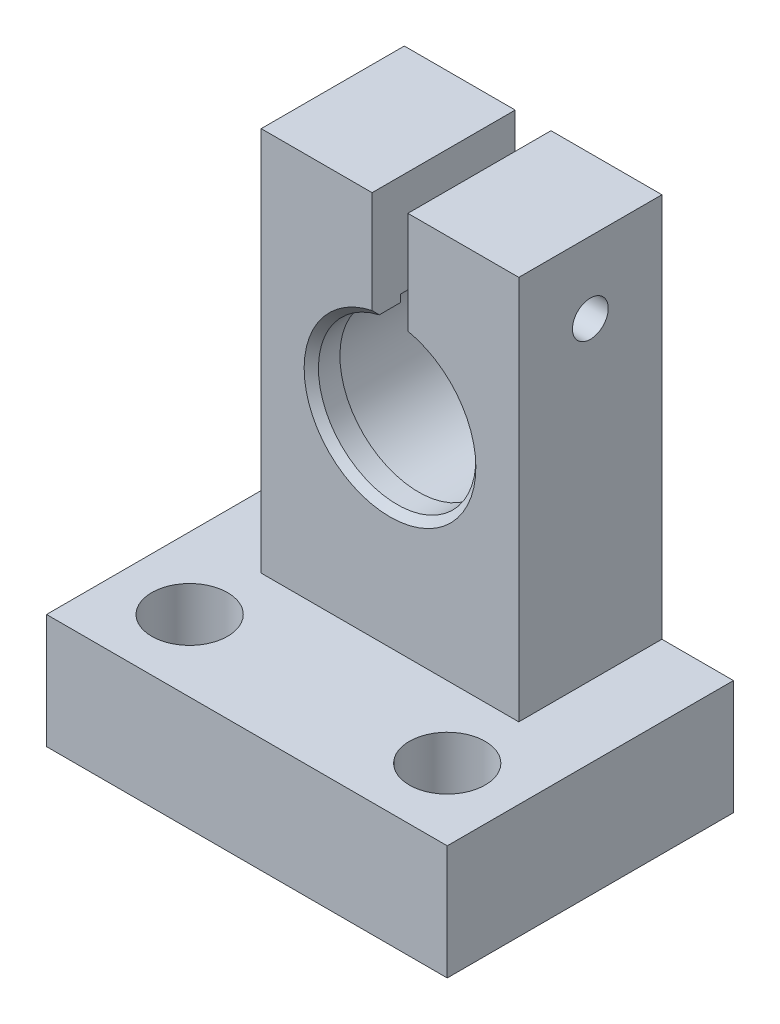
ISO-10303-21;
HEADER;
FILE_DESCRIPTION(('STEP AP214'),'2;1');
FILE_NAME('part.step','',(''),(''),'','','');
FILE_SCHEMA(('AUTOMOTIVE_DESIGN { 1 0 10303 214 1 1 1 1 }'));
ENDSEC;
DATA;
#1=APPLICATION_CONTEXT('core data for automotive mechanical design processes');
#2=APPLICATION_PROTOCOL_DEFINITION('international standard','automotive_design',2000,#1);
#3=PRODUCT_CONTEXT('',#1,'mechanical');
#4=PRODUCT('Part','Part','',(#3));
#5=PRODUCT_RELATED_PRODUCT_CATEGORY('part','',(#4));
#6=PRODUCT_DEFINITION_FORMATION('','',#4);
#7=PRODUCT_DEFINITION_CONTEXT('part definition',#1,'design');
#8=PRODUCT_DEFINITION('design','',#6,#7);
#9=PRODUCT_DEFINITION_SHAPE('','',#8);
#10=(LENGTH_UNIT() NAMED_UNIT(*) SI_UNIT(.MILLI.,.METRE.));
#11=(NAMED_UNIT(*) PLANE_ANGLE_UNIT() SI_UNIT($,.RADIAN.));
#12=(NAMED_UNIT(*) SI_UNIT($,.STERADIAN.) SOLID_ANGLE_UNIT());
#13=UNCERTAINTY_MEASURE_WITH_UNIT(LENGTH_MEASURE(1.E-05),#10,'distance_accuracy_value','');
#14=(GEOMETRIC_REPRESENTATION_CONTEXT(3) GLOBAL_UNCERTAINTY_ASSIGNED_CONTEXT((#13)) GLOBAL_UNIT_ASSIGNED_CONTEXT((#10,
#11,#12)) REPRESENTATION_CONTEXT('',''));
#15=CARTESIAN_POINT('',(0.,0.,0.));
#16=DIRECTION('',(0.,0.,1.));
#17=DIRECTION('',(1.,0.,0.));
#18=AXIS2_PLACEMENT_3D('',#15,#16,#17);
#19=CARTESIAN_POINT('',(42.,-13.9,0.));
#20=DIRECTION('',(0.,-1.,0.));
#21=DIRECTION('',(0.,0.,-1.));
#22=AXIS2_PLACEMENT_3D('',#19,#20,#21);
#23=PLANE('',#22);
#24=DIRECTION('',(0.,0.,-1.));
#25=VECTOR('',#24,1.);
#26=CARTESIAN_POINT('',(37.,-13.9,0.));
#27=LINE('',#26,#25);
#28=CARTESIAN_POINT('',(37.,-13.9,10.));
#29=VERTEX_POINT('',#28);
#30=CARTESIAN_POINT('',(37.,-13.9,0.));
#31=VERTEX_POINT('',#30);
#32=EDGE_CURVE('E193',#29,#31,#27,.T.);
#33=ORIENTED_EDGE('',*,*,#32,.F.);
#34=DIRECTION('',(1.,0.,0.));
#35=VECTOR('',#34,1.);
#36=CARTESIAN_POINT('',(42.,-13.9,10.));
#37=LINE('',#36,#35);
#38=CARTESIAN_POINT('',(19.,-13.9,10.));
#39=VERTEX_POINT('',#38);
#40=EDGE_CURVE('E11',#39,#29,#37,.T.);
#41=ORIENTED_EDGE('',*,*,#40,.F.);
#42=DIRECTION('',(0.,0.,-1.));
#43=VECTOR('',#42,1.);
#44=CARTESIAN_POINT('',(19.,-13.9,0.));
#45=LINE('',#44,#43);
#46=CARTESIAN_POINT('',(19.,-13.9,0.));
#47=VERTEX_POINT('',#46);
#48=EDGE_CURVE('E188',#39,#47,#45,.T.);
#49=ORIENTED_EDGE('',*,*,#48,.T.);
#50=DIRECTION('',(1.,0.,0.));
#51=VECTOR('',#50,1.);
#52=CARTESIAN_POINT('',(14.,-13.9,0.));
#53=LINE('',#52,#51);
#54=CARTESIAN_POINT('',(14.,-13.9,0.));
#55=VERTEX_POINT('',#54);
#56=EDGE_CURVE('E174',#55,#47,#53,.T.);
#57=ORIENTED_EDGE('',*,*,#56,.F.);
#58=DIRECTION('',(0.,0.,-1.));
#59=VECTOR('',#58,1.);
#60=CARTESIAN_POINT('',(14.,-13.9,0.));
#61=LINE('',#60,#59);
#62=CARTESIAN_POINT('',(14.,-13.9,20.));
#63=VERTEX_POINT('',#62);
#64=EDGE_CURVE('E175',#63,#55,#61,.T.);
#65=ORIENTED_EDGE('',*,*,#64,.F.);
#66=DIRECTION('',(-1.,0.,0.));
#67=VECTOR('',#66,1.);
#68=CARTESIAN_POINT('',(42.,-13.9,20.));
#69=LINE('',#68,#67);
#70=CARTESIAN_POINT('',(42.,-13.9,20.));
#71=VERTEX_POINT('',#70);
#72=EDGE_CURVE('E161',#71,#63,#69,.T.);
#73=ORIENTED_EDGE('',*,*,#72,.F.);
#74=DIRECTION('',(0.,0.,-1.));
#75=VECTOR('',#74,1.);
#76=CARTESIAN_POINT('',(42.,-13.9,0.));
#77=LINE('',#76,#75);
#78=CARTESIAN_POINT('',(42.,-13.9,0.));
#79=VERTEX_POINT('',#78);
#80=EDGE_CURVE('E198',#71,#79,#77,.T.);
#81=ORIENTED_EDGE('',*,*,#80,.T.);
#82=DIRECTION('',(-1.,0.,0.));
#83=VECTOR('',#82,1.);
#84=CARTESIAN_POINT('',(42.,-13.9,0.));
#85=LINE('',#84,#83);
#86=EDGE_CURVE('E201',#79,#31,#85,.T.);
#87=ORIENTED_EDGE('',*,*,#86,.T.);
#88=EDGE_LOOP('',(#33,#41,#49,#57,#65,#73,#81,#87));
#89=FACE_BOUND('',#88,.T.);
#90=CARTESIAN_POINT('',(19.,-13.9,15.));
#91=DIRECTION('',(0.,-1.,0.));
#92=DIRECTION('',(0.,0.,1.));
#93=AXIS2_PLACEMENT_3D('',#90,#91,#92);
#94=CIRCLE('',#93,2.65);
#95=CARTESIAN_POINT('',(19.,-13.9,17.65));
#96=VERTEX_POINT('',#95);
#97=EDGE_CURVE('E182',#96,#96,#94,.T.);
#98=ORIENTED_EDGE('',*,*,#97,.T.);
#99=EDGE_LOOP('',(#98));
#100=FACE_BOUND('',#99,.T.);
#101=CARTESIAN_POINT('',(37.,-13.9,15.));
#102=DIRECTION('',(0.,-1.,0.));
#103=DIRECTION('',(0.,0.,1.));
#104=AXIS2_PLACEMENT_3D('',#101,#102,#103);
#105=CIRCLE('',#104,2.65);
#106=CARTESIAN_POINT('',(37.,-13.9,17.65));
#107=VERTEX_POINT('',#106);
#108=EDGE_CURVE('E626',#107,#107,#105,.T.);
#109=ORIENTED_EDGE('',*,*,#108,.T.);
#110=EDGE_LOOP('',(#109));
#111=FACE_BOUND('',#110,.T.);
#112=ADVANCED_FACE('F36',(#89,#100,#111),#23,.F.);
#113=CARTESIAN_POINT('',(37.,-21.9,10.));
#114=DIRECTION('',(-1.,0.,0.));
#115=DIRECTION('',(0.,0.,-1.));
#116=AXIS2_PLACEMENT_3D('',#113,#114,#115);
#117=PLANE('',#116);
#118=CARTESIAN_POINT('',(37.,7.99999999999999,5.));
#119=DIRECTION('',(-1.,0.,0.));
#120=DIRECTION('',(0.,0.,1.));
#121=AXIS2_PLACEMENT_3D('',#118,#119,#120);
#122=CIRCLE('',#121,1.25);
#123=CARTESIAN_POINT('',(37.,7.99999999999999,6.25));
#124=VERTEX_POINT('',#123);
#125=EDGE_CURVE('E205',#124,#124,#122,.T.);
#126=ORIENTED_EDGE('',*,*,#125,.T.);
#127=EDGE_LOOP('',(#126));
#128=FACE_BOUND('',#127,.T.);
#129=ORIENTED_EDGE('',*,*,#32,.T.);
#130=DIRECTION('',(0.,-1.,0.));
#131=VECTOR('',#130,1.);
#132=CARTESIAN_POINT('',(37.,-21.9,0.));
#133=LINE('',#132,#131);
#134=CARTESIAN_POINT('',(37.,13.,0.));
#135=VERTEX_POINT('',#134);
#136=EDGE_CURVE('E254',#135,#31,#133,.T.);
#137=ORIENTED_EDGE('',*,*,#136,.F.);
#138=DIRECTION('',(0.,0.,-1.));
#139=VECTOR('',#138,1.);
#140=CARTESIAN_POINT('',(37.,13.,10.));
#141=LINE('',#140,#139);
#142=CARTESIAN_POINT('',(37.,13.,10.));
#143=VERTEX_POINT('',#142);
#144=EDGE_CURVE('E264',#143,#135,#141,.T.);
#145=ORIENTED_EDGE('',*,*,#144,.F.);
#146=DIRECTION('',(0.,-1.,0.));
#147=VECTOR('',#146,1.);
#148=CARTESIAN_POINT('',(37.,-21.9,10.));
#149=LINE('',#148,#147);
#150=EDGE_CURVE('E61',#143,#29,#149,.T.);
#151=ORIENTED_EDGE('',*,*,#150,.T.);
#152=EDGE_LOOP('',(#129,#137,#145,#151));
#153=FACE_BOUND('',#152,.T.);
#154=ADVANCED_FACE('F336',(#128,#153),#117,.F.);
#155=CARTESIAN_POINT('',(19.,-21.9,10.));
#156=DIRECTION('',(1.,0.,0.));
#157=DIRECTION('',(0.,0.,1.));
#158=AXIS2_PLACEMENT_3D('',#155,#156,#157);
#159=PLANE('',#158);
#160=DIRECTION('',(0.,1.,0.));
#161=VECTOR('',#160,1.);
#162=CARTESIAN_POINT('',(19.,-21.9,10.));
#163=LINE('',#162,#161);
#164=CARTESIAN_POINT('',(19.,13.,10.));
#165=VERTEX_POINT('',#164);
#166=EDGE_CURVE('E256',#39,#165,#163,.T.);
#167=ORIENTED_EDGE('',*,*,#166,.T.);
#168=DIRECTION('',(0.,0.,-1.));
#169=VECTOR('',#168,1.);
#170=CARTESIAN_POINT('',(19.,13.,10.));
#171=LINE('',#170,#169);
#172=CARTESIAN_POINT('',(19.,13.,0.));
#173=VERTEX_POINT('',#172);
#174=EDGE_CURVE('E274',#165,#173,#171,.T.);
#175=ORIENTED_EDGE('',*,*,#174,.T.);
#176=DIRECTION('',(0.,1.,0.));
#177=VECTOR('',#176,1.);
#178=CARTESIAN_POINT('',(19.,-21.9,0.));
#179=LINE('',#178,#177);
#180=EDGE_CURVE('E53',#47,#173,#179,.T.);
#181=ORIENTED_EDGE('',*,*,#180,.F.);
#182=ORIENTED_EDGE('',*,*,#48,.F.);
#183=EDGE_LOOP('',(#167,#175,#181,#182));
#184=FACE_BOUND('',#183,.T.);
#185=CARTESIAN_POINT('',(19.,8.,5.));
#186=DIRECTION('',(1.,0.,0.));
#187=DIRECTION('',(0.,0.,-1.));
#188=AXIS2_PLACEMENT_3D('',#185,#186,#187);
#189=CIRCLE('',#188,3.25);
#190=CARTESIAN_POINT('',(19.,8.,1.75));
#191=VERTEX_POINT('',#190);
#192=EDGE_CURVE('E211',#191,#191,#189,.T.);
#193=ORIENTED_EDGE('',*,*,#192,.T.);
#194=EDGE_LOOP('',(#193));
#195=FACE_BOUND('',#194,.T.);
#196=ADVANCED_FACE('F340',(#184,#195),#159,.F.);
#197=CARTESIAN_POINT('',(19.,13.,10.));
#198=DIRECTION('',(0.,-1.,0.));
#199=DIRECTION('',(-1.,0.,0.));
#200=AXIS2_PLACEMENT_3D('',#197,#198,#199);
#201=PLANE('',#200);
#202=DIRECTION('',(1.,0.,0.));
#203=VECTOR('',#202,1.);
#204=CARTESIAN_POINT('',(19.,13.,10.));
#205=LINE('',#204,#203);
#206=CARTESIAN_POINT('',(29.25,13.,10.));
#207=VERTEX_POINT('',#206);
#208=EDGE_CURVE('E260',#207,#143,#205,.T.);
#209=ORIENTED_EDGE('',*,*,#208,.T.);
#210=ORIENTED_EDGE('',*,*,#144,.T.);
#211=DIRECTION('',(1.,0.,0.));
#212=VECTOR('',#211,1.);
#213=CARTESIAN_POINT('',(19.,13.,0.));
#214=LINE('',#213,#212);
#215=CARTESIAN_POINT('',(29.25,13.,0.));
#216=VERTEX_POINT('',#215);
#217=EDGE_CURVE('E269',#216,#135,#214,.T.);
#218=ORIENTED_EDGE('',*,*,#217,.F.);
#219=DIRECTION('',(0.,0.,1.));
#220=VECTOR('',#219,1.);
#221=CARTESIAN_POINT('',(29.25,13.,0.));
#222=LINE('',#221,#220);
#223=EDGE_CURVE('E236',#216,#207,#222,.T.);
#224=ORIENTED_EDGE('',*,*,#223,.T.);
#225=EDGE_LOOP('',(#209,#210,#218,#224));
#226=FACE_BOUND('',#225,.T.);
#227=ADVANCED_FACE('F349',(#226),#201,.F.);
#228=CARTESIAN_POINT('',(28.,0.,10.));
#229=DIRECTION('',(0.,0.,1.));
#230=DIRECTION('',(-1.,0.,0.));
#231=AXIS2_PLACEMENT_3D('',#228,#229,#230);
#232=PLANE('',#231);
#233=ORIENTED_EDGE('',*,*,#40,.T.);
#234=ORIENTED_EDGE('',*,*,#150,.F.);
#235=ORIENTED_EDGE('',*,*,#208,.F.);
#236=DIRECTION('',(0.,-1.,0.));
#237=VECTOR('',#236,1.);
#238=CARTESIAN_POINT('',(29.25,5.35607132140714,10.));
#239=LINE('',#238,#237);
#240=CARTESIAN_POINT('',(29.25,5.86834729715275,10.));
#241=VERTEX_POINT('',#240);
#242=EDGE_CURVE('E223',#207,#241,#239,.T.);
#243=ORIENTED_EDGE('',*,*,#242,.T.);
#244=CARTESIAN_POINT('',(28.,0.,10.));
#245=DIRECTION('',(0.,0.,-1.));
#246=DIRECTION('',(-1.,0.,0.));
#247=AXIS2_PLACEMENT_3D('',#244,#245,#246);
#248=CIRCLE('',#247,6.);
#249=CARTESIAN_POINT('',(26.75,5.86834729715275,10.));
#250=VERTEX_POINT('',#249);
#251=EDGE_CURVE('E329',#250,#241,#248,.F.);
#252=ORIENTED_EDGE('',*,*,#251,.F.);
#253=DIRECTION('',(0.,1.,0.));
#254=VECTOR('',#253,1.);
#255=CARTESIAN_POINT('',(26.75,5.35607132140714,10.));
#256=LINE('',#255,#254);
#257=CARTESIAN_POINT('',(26.75,13.,10.));
#258=VERTEX_POINT('',#257);
#259=EDGE_CURVE('E228',#250,#258,#256,.T.);
#260=ORIENTED_EDGE('',*,*,#259,.T.);
#261=EDGE_CURVE('E261',#165,#258,#205,.T.);
#262=ORIENTED_EDGE('',*,*,#261,.F.);
#263=ORIENTED_EDGE('',*,*,#166,.F.);
#264=EDGE_LOOP('',(#233,#234,#235,#243,#252,#260,#262,#263));
#265=FACE_BOUND('',#264,.T.);
#266=ADVANCED_FACE('F356',(#265),#232,.T.);
#267=CARTESIAN_POINT('',(28.,0.,0.));
#268=DIRECTION('',(0.,0.,1.));
#269=DIRECTION('',(-1.,0.,0.));
#270=AXIS2_PLACEMENT_3D('',#267,#268,#269);
#271=PLANE('',#270);
#272=DIRECTION('',(0.,-1.,0.));
#273=VECTOR('',#272,1.);
#274=CARTESIAN_POINT('',(29.25,5.35607132140714,0.));
#275=LINE('',#274,#273);
#276=CARTESIAN_POINT('',(29.25,6.37867541108654,0.));
#277=VERTEX_POINT('',#276);
#278=EDGE_CURVE('E224',#216,#277,#275,.T.);
#279=ORIENTED_EDGE('',*,*,#278,.F.);
#280=ORIENTED_EDGE('',*,*,#217,.T.);
#281=ORIENTED_EDGE('',*,*,#136,.T.);
#282=ORIENTED_EDGE('',*,*,#86,.F.);
#283=DIRECTION('',(0.,-1.,0.));
#284=VECTOR('',#283,1.);
#285=CARTESIAN_POINT('',(42.,-21.9,0.));
#286=LINE('',#285,#284);
#287=CARTESIAN_POINT('',(42.,-21.9,0.));
#288=VERTEX_POINT('',#287);
#289=EDGE_CURVE('E194',#79,#288,#286,.T.);
#290=ORIENTED_EDGE('',*,*,#289,.T.);
#291=DIRECTION('',(-1.,0.,0.));
#292=VECTOR('',#291,1.);
#293=CARTESIAN_POINT('',(19.,-21.9,0.));
#294=LINE('',#293,#292);
#295=CARTESIAN_POINT('',(14.,-21.9,0.));
#296=VERTEX_POINT('',#295);
#297=EDGE_CURVE('E266',#288,#296,#294,.T.);
#298=ORIENTED_EDGE('',*,*,#297,.T.);
#299=DIRECTION('',(0.,-1.,0.));
#300=VECTOR('',#299,1.);
#301=CARTESIAN_POINT('',(14.,-21.9,0.));
#302=LINE('',#301,#300);
#303=EDGE_CURVE('E170',#55,#296,#302,.T.);
#304=ORIENTED_EDGE('',*,*,#303,.F.);
#305=ORIENTED_EDGE('',*,*,#56,.T.);
#306=ORIENTED_EDGE('',*,*,#180,.T.);
#307=CARTESIAN_POINT('',(26.75,13.,0.));
#308=VERTEX_POINT('',#307);
#309=EDGE_CURVE('E257',#173,#308,#214,.T.);
#310=ORIENTED_EDGE('',*,*,#309,.T.);
#311=DIRECTION('',(0.,1.,0.));
#312=VECTOR('',#311,1.);
#313=CARTESIAN_POINT('',(26.75,5.35607132140714,0.));
#314=LINE('',#313,#312);
#315=CARTESIAN_POINT('',(26.75,6.37867541108654,0.));
#316=VERTEX_POINT('',#315);
#317=EDGE_CURVE('E227',#316,#308,#314,.T.);
#318=ORIENTED_EDGE('',*,*,#317,.F.);
#319=CARTESIAN_POINT('',(28.,0.,0.));
#320=DIRECTION('',(0.,0.,-1.));
#321=DIRECTION('',(-1.,0.,0.));
#322=AXIS2_PLACEMENT_3D('',#319,#320,#321);
#323=CIRCLE('',#322,6.5);
#324=EDGE_CURVE('E284',#277,#316,#323,.T.);
#325=ORIENTED_EDGE('',*,*,#324,.F.);
#326=EDGE_LOOP('',(#279,#280,#281,#282,#290,#298,#304,#305,#306,#310,#318,#325));
#327=FACE_BOUND('',#326,.T.);
#328=ADVANCED_FACE('F345',(#327),#271,.F.);
#329=CARTESIAN_POINT('',(19.,-21.9,10.));
#330=DIRECTION('',(0.,1.,0.));
#331=DIRECTION('',(1.,0.,0.));
#332=AXIS2_PLACEMENT_3D('',#329,#330,#331);
#333=PLANE('',#332);
#334=CARTESIAN_POINT('',(37.,-21.9,15.));
#335=DIRECTION('',(0.,-1.,0.));
#336=DIRECTION('',(1.,0.,0.));
#337=AXIS2_PLACEMENT_3D('',#334,#335,#336);
#338=CIRCLE('',#337,2.65);
#339=CARTESIAN_POINT('',(39.65,-21.9,15.));
#340=VERTEX_POINT('',#339);
#341=EDGE_CURVE('E623',#340,#340,#338,.T.);
#342=ORIENTED_EDGE('',*,*,#341,.F.);
#343=EDGE_LOOP('',(#342));
#344=FACE_BOUND('',#343,.T.);
#345=CARTESIAN_POINT('',(19.,-21.9,15.));
#346=DIRECTION('',(0.,-1.,0.));
#347=DIRECTION('',(1.,0.,0.));
#348=AXIS2_PLACEMENT_3D('',#345,#346,#347);
#349=CIRCLE('',#348,2.65);
#350=CARTESIAN_POINT('',(21.65,-21.9,15.));
#351=VERTEX_POINT('',#350);
#352=EDGE_CURVE('E179',#351,#351,#349,.T.);
#353=ORIENTED_EDGE('',*,*,#352,.F.);
#354=EDGE_LOOP('',(#353));
#355=FACE_BOUND('',#354,.T.);
#356=ORIENTED_EDGE('',*,*,#297,.F.);
#357=DIRECTION('',(0.,0.,1.));
#358=VECTOR('',#357,1.);
#359=CARTESIAN_POINT('',(42.,-21.9,0.));
#360=LINE('',#359,#358);
#361=CARTESIAN_POINT('',(42.,-21.9,20.));
#362=VERTEX_POINT('',#361);
#363=EDGE_CURVE('E178',#288,#362,#360,.T.);
#364=ORIENTED_EDGE('',*,*,#363,.T.);
#365=DIRECTION('',(1.,0.,0.));
#366=VECTOR('',#365,1.);
#367=CARTESIAN_POINT('',(42.,-21.9,20.));
#368=LINE('',#367,#366);
#369=CARTESIAN_POINT('',(14.,-21.9,20.));
#370=VERTEX_POINT('',#369);
#371=EDGE_CURVE('E158',#370,#362,#368,.T.);
#372=ORIENTED_EDGE('',*,*,#371,.F.);
#373=DIRECTION('',(0.,0.,1.));
#374=VECTOR('',#373,1.);
#375=CARTESIAN_POINT('',(14.,-21.9,0.));
#376=LINE('',#375,#374);
#377=EDGE_CURVE('E168',#296,#370,#376,.T.);
#378=ORIENTED_EDGE('',*,*,#377,.F.);
#379=EDGE_LOOP('',(#356,#364,#372,#378));
#380=FACE_BOUND('',#379,.T.);
#381=ADVANCED_FACE('F177',(#344,#355,#380),#333,.F.);
#382=ORIENTED_EDGE('',*,*,#309,.F.);
#383=ORIENTED_EDGE('',*,*,#174,.F.);
#384=ORIENTED_EDGE('',*,*,#261,.T.);
#385=DIRECTION('',(0.,0.,1.));
#386=VECTOR('',#385,1.);
#387=CARTESIAN_POINT('',(26.75,13.,0.));
#388=LINE('',#387,#386);
#389=EDGE_CURVE('E231',#308,#258,#388,.T.);
#390=ORIENTED_EDGE('',*,*,#389,.F.);
#391=EDGE_LOOP('',(#382,#383,#384,#390));
#392=FACE_BOUND('',#391,.T.);
#393=ADVANCED_FACE('F344',(#392),#201,.F.);
#394=CARTESIAN_POINT('',(28.,0.,10.));
#395=DIRECTION('',(0.,0.,-1.));
#396=DIRECTION('',(1.,0.,0.));
#397=AXIS2_PLACEMENT_3D('',#394,#395,#396);
#398=CYLINDRICAL_SURFACE('',#397,6.);
#399=DIRECTION('',(0.,0.,-1.));
#400=VECTOR('',#399,1.);
#401=CARTESIAN_POINT('',(26.75,5.86834729715275,10.));
#402=LINE('',#401,#400);
#403=CARTESIAN_POINT('',(26.75,5.86834729715275,0.500000000000002));
#404=VERTEX_POINT('',#403);
#405=CARTESIAN_POINT('',(26.75,5.86834729715275,8.));
#406=VERTEX_POINT('',#405);
#407=EDGE_CURVE('E243',#404,#406,#402,.F.);
#408=ORIENTED_EDGE('',*,*,#407,.T.);
#409=CARTESIAN_POINT('',(28.,0.,8.));
#410=DIRECTION('',(0.,0.,1.));
#411=DIRECTION('',(1.,0.,0.));
#412=AXIS2_PLACEMENT_3D('',#409,#410,#411);
#413=CIRCLE('',#412,6.);
#414=CARTESIAN_POINT('',(29.25,5.86834729715275,8.));
#415=VERTEX_POINT('',#414);
#416=EDGE_CURVE('E276',#406,#415,#413,.T.);
#417=ORIENTED_EDGE('',*,*,#416,.T.);
#418=DIRECTION('',(0.,0.,-1.));
#419=VECTOR('',#418,1.);
#420=CARTESIAN_POINT('',(29.25,5.86834729715275,10.));
#421=LINE('',#420,#419);
#422=CARTESIAN_POINT('',(29.25,5.86834729715275,0.500000000000002));
#423=VERTEX_POINT('',#422);
#424=EDGE_CURVE('E248',#415,#423,#421,.T.);
#425=ORIENTED_EDGE('',*,*,#424,.T.);
#426=CARTESIAN_POINT('',(28.,0.,0.500000000000002));
#427=DIRECTION('',(0.,0.,-1.));
#428=DIRECTION('',(-1.,0.,0.));
#429=AXIS2_PLACEMENT_3D('',#426,#427,#428);
#430=CIRCLE('',#429,6.);
#431=EDGE_CURVE('E421',#404,#423,#430,.F.);
#432=ORIENTED_EDGE('',*,*,#431,.F.);
#433=EDGE_LOOP('',(#408,#417,#425,#432));
#434=FACE_BOUND('',#433,.T.);
#435=ADVANCED_FACE('F352',(#434),#398,.F.);
#436=CARTESIAN_POINT('',(28.,0.,8.));
#437=DIRECTION('',(0.,0.,-1.));
#438=DIRECTION('',(1.,0.,0.));
#439=AXIS2_PLACEMENT_3D('',#436,#437,#438);
#440=PLANE('',#439);
#441=DIRECTION('',(0.,1.,0.));
#442=VECTOR('',#441,1.);
#443=CARTESIAN_POINT('',(29.25,0.,8.));
#444=LINE('',#443,#442);
#445=CARTESIAN_POINT('',(29.25,5.35607132140714,8.));
#446=VERTEX_POINT('',#445);
#447=EDGE_CURVE('E246',#446,#415,#444,.T.);
#448=ORIENTED_EDGE('',*,*,#447,.T.);
#449=ORIENTED_EDGE('',*,*,#416,.F.);
#450=DIRECTION('',(0.,-1.,0.));
#451=VECTOR('',#450,1.);
#452=CARTESIAN_POINT('',(26.75,0.,8.));
#453=LINE('',#452,#451);
#454=CARTESIAN_POINT('',(26.75,5.35607132140714,8.));
#455=VERTEX_POINT('',#454);
#456=EDGE_CURVE('E239',#406,#455,#453,.T.);
#457=ORIENTED_EDGE('',*,*,#456,.T.);
#458=CARTESIAN_POINT('',(28.,0.,8.));
#459=DIRECTION('',(0.,0.,1.));
#460=DIRECTION('',(1.,0.,0.));
#461=AXIS2_PLACEMENT_3D('',#458,#459,#460);
#462=CIRCLE('',#461,5.5);
#463=EDGE_CURVE('E251',#455,#446,#462,.T.);
#464=ORIENTED_EDGE('',*,*,#463,.T.);
#465=EDGE_LOOP('',(#448,#449,#457,#464));
#466=FACE_BOUND('',#465,.T.);
#467=ADVANCED_FACE('F362',(#466),#440,.T.);
#468=CARTESIAN_POINT('',(28.,0.,8.));
#469=DIRECTION('',(0.,0.,1.));
#470=DIRECTION('',(-1.,0.,0.));
#471=AXIS2_PLACEMENT_3D('',#468,#469,#470);
#472=CYLINDRICAL_SURFACE('',#471,5.5);
#473=DIRECTION('',(0.,0.,1.));
#474=VECTOR('',#473,1.);
#475=CARTESIAN_POINT('',(29.25,5.35607132140714,8.));
#476=LINE('',#475,#474);
#477=CARTESIAN_POINT('',(29.25,5.35607132140714,9.5));
#478=VERTEX_POINT('',#477);
#479=EDGE_CURVE('E279',#478,#446,#476,.F.);
#480=ORIENTED_EDGE('',*,*,#479,.T.);
#481=ORIENTED_EDGE('',*,*,#463,.F.);
#482=DIRECTION('',(0.,0.,1.));
#483=VECTOR('',#482,1.);
#484=CARTESIAN_POINT('',(26.75,5.35607132140714,8.));
#485=LINE('',#484,#483);
#486=CARTESIAN_POINT('',(26.75,5.35607132140714,9.5));
#487=VERTEX_POINT('',#486);
#488=EDGE_CURVE('E281',#455,#487,#485,.T.);
#489=ORIENTED_EDGE('',*,*,#488,.T.);
#490=CARTESIAN_POINT('',(28.,0.,9.5));
#491=DIRECTION('',(0.,0.,-1.));
#492=DIRECTION('',(-1.,0.,0.));
#493=AXIS2_PLACEMENT_3D('',#490,#491,#492);
#494=CIRCLE('',#493,5.5);
#495=EDGE_CURVE('E41',#478,#487,#494,.T.);
#496=ORIENTED_EDGE('',*,*,#495,.F.);
#497=EDGE_LOOP('',(#480,#481,#489,#496));
#498=FACE_BOUND('',#497,.T.);
#499=ADVANCED_FACE('F313',(#498),#472,.F.);
#500=CARTESIAN_POINT('',(29.25,5.35607132140714,0.));
#501=DIRECTION('',(1.,0.,0.));
#502=DIRECTION('',(0.,-1.,0.));
#503=AXIS2_PLACEMENT_3D('',#500,#501,#502);
#504=PLANE('',#503);
#505=CARTESIAN_POINT('',(29.25,7.99999999999999,5.));
#506=DIRECTION('',(-1.,0.,0.));
#507=DIRECTION('',(0.,-1.,0.));
#508=AXIS2_PLACEMENT_3D('',#505,#506,#507);
#509=CIRCLE('',#508,1.25);
#510=CARTESIAN_POINT('',(29.25,6.75,5.));
#511=VERTEX_POINT('',#510);
#512=EDGE_CURVE('E208',#511,#511,#509,.T.);
#513=ORIENTED_EDGE('',*,*,#512,.F.);
#514=EDGE_LOOP('',(#513));
#515=FACE_BOUND('',#514,.T.);
#516=ORIENTED_EDGE('',*,*,#424,.F.);
#517=ORIENTED_EDGE('',*,*,#447,.F.);
#518=ORIENTED_EDGE('',*,*,#479,.F.);
#519=CARTESIAN_POINT('',(29.25,5.86834729715275,10.));
#520=CARTESIAN_POINT('',(29.25,5.7830579908845,9.91657443556982));
#521=CARTESIAN_POINT('',(29.25,5.697723673647,9.83319498721601));
#522=CARTESIAN_POINT('',(29.25,5.52696501506741,9.66652832054701));
#523=CARTESIAN_POINT('',(29.25,5.44154067372304,9.58324110223414));
#524=CARTESIAN_POINT('',(29.25,5.35607132140714,9.5));
#525=B_SPLINE_CURVE_WITH_KNOTS('',3,(#519,#520,#521,#522,#523,#524),.UNSPECIFIED.,.F.,.F.,(4,2,
4),(0.,0.35791996724907,0.715839943578595),.UNSPECIFIED.);
#526=EDGE_CURVE('E318',#241,#478,#525,.T.);
#527=ORIENTED_EDGE('',*,*,#526,.F.);
#528=ORIENTED_EDGE('',*,*,#242,.F.);
#529=ORIENTED_EDGE('',*,*,#223,.F.);
#530=ORIENTED_EDGE('',*,*,#278,.T.);
#531=CARTESIAN_POINT('',(29.25,5.86834729715275,0.500000000000002));
#532=CARTESIAN_POINT('',(29.25,5.95347153411322,0.416737653453886));
#533=CARTESIAN_POINT('',(29.25,6.03856099571727,0.333439813223666));
#534=CARTESIAN_POINT('',(29.25,6.20867036702756,0.16677314655601));
#535=CARTESIAN_POINT('',(29.25,6.29369027673477,0.0834043201195623));
#536=CARTESIAN_POINT('',(29.25,6.37867541108654,0.));
#537=B_SPLINE_CURVE_WITH_KNOTS('',3,(#531,#532,#533,#534,#535,#536),.UNSPECIFIED.,.F.,.F.,(4,2,
4),(0.,0.35722362739295,0.714447249809099),.UNSPECIFIED.);
#538=EDGE_CURVE('E324',#423,#277,#537,.T.);
#539=ORIENTED_EDGE('',*,*,#538,.F.);
#540=EDGE_LOOP('',(#516,#517,#518,#527,#528,#529,#530,#539));
#541=FACE_BOUND('',#540,.T.);
#542=ADVANCED_FACE('F306',(#515,#541),#504,.F.);
#543=CARTESIAN_POINT('',(26.75,5.35607132140714,0.));
#544=DIRECTION('',(-1.,0.,0.));
#545=DIRECTION('',(0.,1.,0.));
#546=AXIS2_PLACEMENT_3D('',#543,#544,#545);
#547=PLANE('',#546);
#548=CARTESIAN_POINT('',(26.75,8.,5.));
#549=DIRECTION('',(1.,0.,0.));
#550=DIRECTION('',(0.,1.,0.));
#551=AXIS2_PLACEMENT_3D('',#548,#549,#550);
#552=CIRCLE('',#551,1.6);
#553=CARTESIAN_POINT('',(26.75,9.6,5.));
#554=VERTEX_POINT('',#553);
#555=EDGE_CURVE('E220',#554,#554,#552,.T.);
#556=ORIENTED_EDGE('',*,*,#555,.F.);
#557=EDGE_LOOP('',(#556));
#558=FACE_BOUND('',#557,.T.);
#559=ORIENTED_EDGE('',*,*,#317,.T.);
#560=ORIENTED_EDGE('',*,*,#389,.T.);
#561=ORIENTED_EDGE('',*,*,#259,.F.);
#562=CARTESIAN_POINT('',(26.75,5.35607132140714,9.5));
#563=CARTESIAN_POINT('',(26.75,5.44154067372304,9.58324110223414));
#564=CARTESIAN_POINT('',(26.75,5.52696501506741,9.66652832054701));
#565=CARTESIAN_POINT('',(26.75,5.697723673647,9.83319498721601));
#566=CARTESIAN_POINT('',(26.75,5.7830579908845,9.91657443556982));
#567=CARTESIAN_POINT('',(26.75,5.86834729715275,10.));
#568=B_SPLINE_CURVE_WITH_KNOTS('',3,(#562,#563,#564,#565,#566,#567),.UNSPECIFIED.,.F.,.F.,(4,2,
4),(0.,0.357919976329525,0.715839943578595),.UNSPECIFIED.);
#569=EDGE_CURVE('E287',#487,#250,#568,.T.);
#570=ORIENTED_EDGE('',*,*,#569,.F.);
#571=ORIENTED_EDGE('',*,*,#488,.F.);
#572=ORIENTED_EDGE('',*,*,#456,.F.);
#573=ORIENTED_EDGE('',*,*,#407,.F.);
#574=CARTESIAN_POINT('',(26.75,6.37867541108654,0.));
#575=CARTESIAN_POINT('',(26.75,6.29369027673477,0.0834043201195621));
#576=CARTESIAN_POINT('',(26.75,6.20867036702756,0.166773146556009));
#577=CARTESIAN_POINT('',(26.75,6.03856099571727,0.333439813223666));
#578=CARTESIAN_POINT('',(26.75,5.95347153411322,0.416737653453886));
#579=CARTESIAN_POINT('',(26.75,5.86834729715275,0.500000000000002));
#580=B_SPLINE_CURVE_WITH_KNOTS('',3,(#574,#575,#576,#577,#578,#579),.UNSPECIFIED.,.F.,.F.,(4,2,
4),(0.,0.357223622416149,0.714447249809099),.UNSPECIFIED.);
#581=EDGE_CURVE('E294',#316,#404,#580,.T.);
#582=ORIENTED_EDGE('',*,*,#581,.F.);
#583=EDGE_LOOP('',(#559,#560,#561,#570,#571,#572,#573,#582));
#584=FACE_BOUND('',#583,.T.);
#585=ADVANCED_FACE('F300',(#558,#584),#547,.F.);
#586=CARTESIAN_POINT('',(19.,8.,5.));
#587=DIRECTION('',(-1.,0.,0.));
#588=DIRECTION('',(0.,0.,-1.));
#589=AXIS2_PLACEMENT_3D('',#586,#587,#588);
#590=CYLINDRICAL_SURFACE('',#589,1.6);
#591=ORIENTED_EDGE('',*,*,#555,.T.);
#592=EDGE_LOOP('',(#591));
#593=FACE_BOUND('',#592,.T.);
#594=CARTESIAN_POINT('',(22.,8.,5.));
#595=DIRECTION('',(1.,0.,0.));
#596=DIRECTION('',(0.,0.,-1.));
#597=AXIS2_PLACEMENT_3D('',#594,#595,#596);
#598=CIRCLE('',#597,1.6);
#599=CARTESIAN_POINT('',(22.,8.,3.4));
#600=VERTEX_POINT('',#599);
#601=EDGE_CURVE('E217',#600,#600,#598,.T.);
#602=ORIENTED_EDGE('',*,*,#601,.F.);
#603=EDGE_LOOP('',(#602));
#604=FACE_BOUND('',#603,.T.);
#605=ADVANCED_FACE('F305',(#593,#604),#590,.F.);
#606=CARTESIAN_POINT('',(22.,9.6,5.));
#607=DIRECTION('',(1.,0.,0.));
#608=DIRECTION('',(0.,0.,1.));
#609=AXIS2_PLACEMENT_3D('',#606,#607,#608);
#610=PLANE('',#609);
#611=ORIENTED_EDGE('',*,*,#601,.T.);
#612=EDGE_LOOP('',(#611));
#613=FACE_BOUND('',#612,.T.);
#614=CARTESIAN_POINT('',(22.,8.,5.));
#615=DIRECTION('',(1.,0.,0.));
#616=DIRECTION('',(0.,0.,-1.));
#617=AXIS2_PLACEMENT_3D('',#614,#615,#616);
#618=CIRCLE('',#617,3.25);
#619=CARTESIAN_POINT('',(22.,8.,1.75));
#620=VERTEX_POINT('',#619);
#621=EDGE_CURVE('E214',#620,#620,#618,.T.);
#622=ORIENTED_EDGE('',*,*,#621,.F.);
#623=EDGE_LOOP('',(#622));
#624=FACE_BOUND('',#623,.T.);
#625=ADVANCED_FACE('F386',(#613,#624),#610,.F.);
#626=CARTESIAN_POINT('',(19.,8.,5.));
#627=DIRECTION('',(-1.,0.,0.));
#628=DIRECTION('',(0.,0.,-1.));
#629=AXIS2_PLACEMENT_3D('',#626,#627,#628);
#630=CYLINDRICAL_SURFACE('',#629,3.25);
#631=ORIENTED_EDGE('',*,*,#621,.T.);
#632=EDGE_LOOP('',(#631));
#633=FACE_BOUND('',#632,.T.);
#634=ORIENTED_EDGE('',*,*,#192,.F.);
#635=EDGE_LOOP('',(#634));
#636=FACE_BOUND('',#635,.T.);
#637=ADVANCED_FACE('F383',(#633,#636),#630,.F.);
#638=CARTESIAN_POINT('',(37.,7.99999999999999,5.));
#639=DIRECTION('',(1.,0.,0.));
#640=DIRECTION('',(0.,0.,1.));
#641=AXIS2_PLACEMENT_3D('',#638,#639,#640);
#642=CYLINDRICAL_SURFACE('',#641,1.25);
#643=ORIENTED_EDGE('',*,*,#512,.T.);
#644=EDGE_LOOP('',(#643));
#645=FACE_BOUND('',#644,.T.);
#646=ORIENTED_EDGE('',*,*,#125,.F.);
#647=EDGE_LOOP('',(#646));
#648=FACE_BOUND('',#647,.T.);
#649=ADVANCED_FACE('F334',(#645,#648),#642,.F.);
#650=CARTESIAN_POINT('',(28.,0.,0.));
#651=DIRECTION('',(0.,0.,-1.));
#652=DIRECTION('',(1.,0.,0.));
#653=AXIS2_PLACEMENT_3D('',#650,#651,#652);
#654=CONICAL_SURFACE('',#653,6.5,0.785398163397444);
#655=ORIENTED_EDGE('',*,*,#538,.T.);
#656=ORIENTED_EDGE('',*,*,#324,.T.);
#657=ORIENTED_EDGE('',*,*,#581,.T.);
#658=ORIENTED_EDGE('',*,*,#431,.T.);
#659=EDGE_LOOP('',(#655,#656,#657,#658));
#660=FACE_BOUND('',#659,.T.);
#661=ADVANCED_FACE('F330',(#660),#654,.F.);
#662=CARTESIAN_POINT('',(28.,0.,10.));
#663=DIRECTION('',(0.,0.,1.));
#664=DIRECTION('',(-1.,0.,0.));
#665=AXIS2_PLACEMENT_3D('',#662,#663,#664);
#666=CONICAL_SURFACE('',#665,6.,0.785398163397447);
#667=ORIENTED_EDGE('',*,*,#569,.T.);
#668=ORIENTED_EDGE('',*,*,#251,.T.);
#669=ORIENTED_EDGE('',*,*,#526,.T.);
#670=ORIENTED_EDGE('',*,*,#495,.T.);
#671=EDGE_LOOP('',(#667,#668,#669,#670));
#672=FACE_BOUND('',#671,.T.);
#673=ADVANCED_FACE('F38',(#672),#666,.F.);
#674=CARTESIAN_POINT('',(42.,0.,0.));
#675=DIRECTION('',(-1.,0.,0.));
#676=DIRECTION('',(0.,0.,-1.));
#677=AXIS2_PLACEMENT_3D('',#674,#675,#676);
#678=PLANE('',#677);
#679=ORIENTED_EDGE('',*,*,#289,.F.);
#680=ORIENTED_EDGE('',*,*,#80,.F.);
#681=DIRECTION('',(0.,-1.,0.));
#682=VECTOR('',#681,1.);
#683=CARTESIAN_POINT('',(42.,15.832137494637,20.));
#684=LINE('',#683,#682);
#685=EDGE_CURVE('E165',#71,#362,#684,.T.);
#686=ORIENTED_EDGE('',*,*,#685,.T.);
#687=ORIENTED_EDGE('',*,*,#363,.F.);
#688=EDGE_LOOP('',(#679,#680,#686,#687));
#689=FACE_BOUND('',#688,.T.);
#690=ADVANCED_FACE('F379',(#689),#678,.F.);
#691=CARTESIAN_POINT('',(14.,0.,0.));
#692=DIRECTION('',(1.,0.,0.));
#693=DIRECTION('',(0.,0.,-1.));
#694=AXIS2_PLACEMENT_3D('',#691,#692,#693);
#695=PLANE('',#694);
#696=ORIENTED_EDGE('',*,*,#303,.T.);
#697=ORIENTED_EDGE('',*,*,#377,.T.);
#698=DIRECTION('',(0.,-1.,0.));
#699=VECTOR('',#698,1.);
#700=CARTESIAN_POINT('',(14.,15.832137494637,20.));
#701=LINE('',#700,#699);
#702=EDGE_CURVE('E154',#63,#370,#701,.T.);
#703=ORIENTED_EDGE('',*,*,#702,.F.);
#704=ORIENTED_EDGE('',*,*,#64,.T.);
#705=EDGE_LOOP('',(#696,#697,#703,#704));
#706=FACE_BOUND('',#705,.T.);
#707=ADVANCED_FACE('F169',(#706),#695,.F.);
#708=CARTESIAN_POINT('',(42.,15.832137494637,20.));
#709=DIRECTION('',(0.,0.,1.));
#710=DIRECTION('',(-1.,0.,0.));
#711=AXIS2_PLACEMENT_3D('',#708,#709,#710);
#712=PLANE('',#711);
#713=ORIENTED_EDGE('',*,*,#72,.T.);
#714=ORIENTED_EDGE('',*,*,#702,.T.);
#715=ORIENTED_EDGE('',*,*,#371,.T.);
#716=ORIENTED_EDGE('',*,*,#685,.F.);
#717=EDGE_LOOP('',(#713,#714,#715,#716));
#718=FACE_BOUND('',#717,.T.);
#719=ADVANCED_FACE('F156',(#718),#712,.T.);
#720=CARTESIAN_POINT('',(19.,-13.9,15.));
#721=DIRECTION('',(0.,1.,0.));
#722=DIRECTION('',(0.,0.,1.));
#723=AXIS2_PLACEMENT_3D('',#720,#721,#722);
#724=CYLINDRICAL_SURFACE('',#723,2.65);
#725=ORIENTED_EDGE('',*,*,#352,.T.);
#726=EDGE_LOOP('',(#725));
#727=FACE_BOUND('',#726,.T.);
#728=ORIENTED_EDGE('',*,*,#97,.F.);
#729=EDGE_LOOP('',(#728));
#730=FACE_BOUND('',#729,.T.);
#731=ADVANCED_FACE('F597',(#727,#730),#724,.F.);
#732=CARTESIAN_POINT('',(37.,-13.9,15.));
#733=DIRECTION('',(0.,1.,0.));
#734=DIRECTION('',(0.,0.,1.));
#735=AXIS2_PLACEMENT_3D('',#732,#733,#734);
#736=CYLINDRICAL_SURFACE('',#735,2.65);
#737=ORIENTED_EDGE('',*,*,#341,.T.);
#738=EDGE_LOOP('',(#737));
#739=FACE_BOUND('',#738,.T.);
#740=ORIENTED_EDGE('',*,*,#108,.F.);
#741=EDGE_LOOP('',(#740));
#742=FACE_BOUND('',#741,.T.);
#743=ADVANCED_FACE('F605',(#739,#742),#736,.F.);
#744=CLOSED_SHELL('',(#112,#154,#196,#227,#266,#328,#381,#393,#435,#467,#499,#542,#585,#605,
#625,#637,#649,#661,#673,#690,#707,#719,#731,#743));
#745=MANIFOLD_SOLID_BREP('B2',#744);
#746=ADVANCED_BREP_SHAPE_REPRESENTATION('',(#18,#745),#14);
#747=SHAPE_DEFINITION_REPRESENTATION(#9,#746);
ENDSEC;
END-ISO-10303-21;
